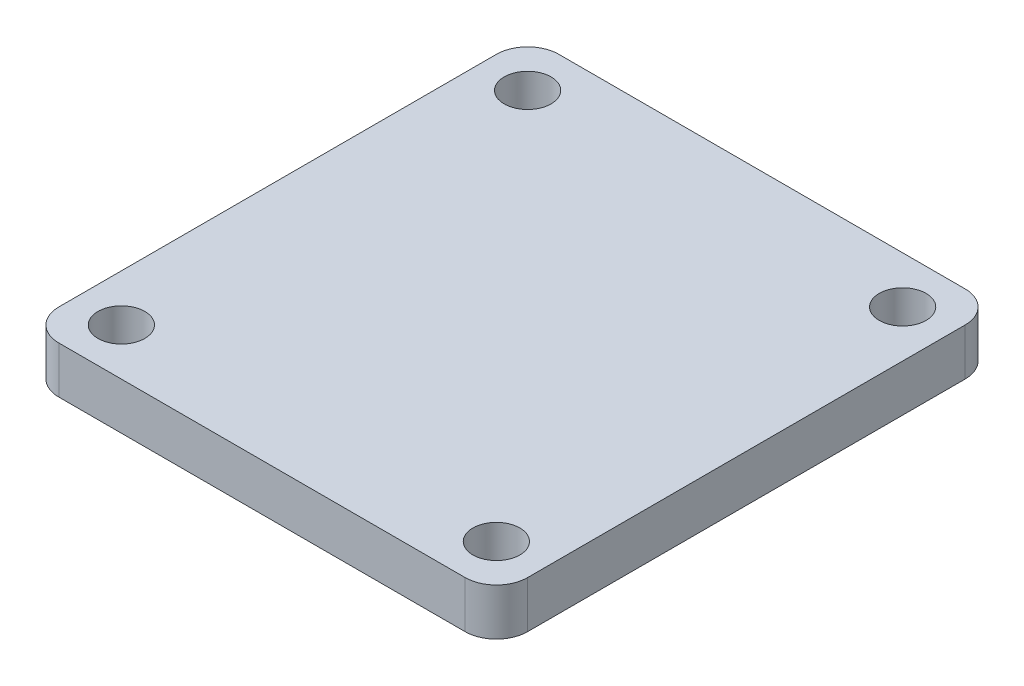
ISO-10303-21;
HEADER;
FILE_DESCRIPTION(('STEP AP214'),'2;1');
FILE_NAME('part.step','',(''),(''),'','','');
FILE_SCHEMA(('AUTOMOTIVE_DESIGN { 1 0 10303 214 1 1 1 1 }'));
ENDSEC;
DATA;
#1=APPLICATION_CONTEXT('core data for automotive mechanical design processes');
#2=APPLICATION_PROTOCOL_DEFINITION('international standard','automotive_design',2000,#1);
#3=PRODUCT_CONTEXT('',#1,'mechanical');
#4=PRODUCT('Part','Part','',(#3));
#5=PRODUCT_RELATED_PRODUCT_CATEGORY('part','',(#4));
#6=PRODUCT_DEFINITION_FORMATION('','',#4);
#7=PRODUCT_DEFINITION_CONTEXT('part definition',#1,'design');
#8=PRODUCT_DEFINITION('design','',#6,#7);
#9=PRODUCT_DEFINITION_SHAPE('','',#8);
#10=(LENGTH_UNIT() NAMED_UNIT(*) SI_UNIT(.MILLI.,.METRE.));
#11=(NAMED_UNIT(*) PLANE_ANGLE_UNIT() SI_UNIT($,.RADIAN.));
#12=(NAMED_UNIT(*) SI_UNIT($,.STERADIAN.) SOLID_ANGLE_UNIT());
#13=UNCERTAINTY_MEASURE_WITH_UNIT(LENGTH_MEASURE(1.E-05),#10,'distance_accuracy_value','');
#14=(GEOMETRIC_REPRESENTATION_CONTEXT(3) GLOBAL_UNCERTAINTY_ASSIGNED_CONTEXT((#13)) GLOBAL_UNIT_ASSIGNED_CONTEXT((#10,
#11,#12)) REPRESENTATION_CONTEXT('',''));
#15=CARTESIAN_POINT('',(0.,0.,0.));
#16=DIRECTION('',(0.,0.,1.));
#17=DIRECTION('',(1.,0.,0.));
#18=AXIS2_PLACEMENT_3D('',#15,#16,#17);
#19=CARTESIAN_POINT('',(0.,3.,0.));
#20=DIRECTION('',(0.,-1.,0.));
#21=DIRECTION('',(0.,0.,-1.));
#22=AXIS2_PLACEMENT_3D('',#19,#20,#21);
#23=PLANE('',#22);
#24=DIRECTION('',(-1.,0.,0.));
#25=VECTOR('',#24,1.);
#26=CARTESIAN_POINT('',(-15.,3.,-16.));
#27=LINE('',#26,#25);
#28=CARTESIAN_POINT('',(13.,3.,-16.));
#29=VERTEX_POINT('',#28);
#30=CARTESIAN_POINT('',(-13.,3.,-16.));
#31=VERTEX_POINT('',#30);
#32=EDGE_CURVE('E178',#29,#31,#27,.T.);
#33=ORIENTED_EDGE('',*,*,#32,.T.);
#34=CARTESIAN_POINT('',(-13.,3.,-14.));
#35=DIRECTION('',(0.,-1.,0.));
#36=DIRECTION('',(0.,0.,-1.));
#37=AXIS2_PLACEMENT_3D('',#34,#35,#36);
#38=CIRCLE('',#37,2.);
#39=CARTESIAN_POINT('',(-15.,3.,-14.));
#40=VERTEX_POINT('',#39);
#41=EDGE_CURVE('E155',#31,#40,#38,.F.);
#42=ORIENTED_EDGE('',*,*,#41,.T.);
#43=DIRECTION('',(0.,0.,1.));
#44=VECTOR('',#43,1.);
#45=CARTESIAN_POINT('',(-15.,3.,16.));
#46=LINE('',#45,#44);
#47=CARTESIAN_POINT('',(-15.,3.,14.));
#48=VERTEX_POINT('',#47);
#49=EDGE_CURVE('E125',#40,#48,#46,.T.);
#50=ORIENTED_EDGE('',*,*,#49,.T.);
#51=CARTESIAN_POINT('',(-13.,3.,14.));
#52=DIRECTION('',(0.,-1.,0.));
#53=DIRECTION('',(0.,0.,-1.));
#54=AXIS2_PLACEMENT_3D('',#51,#52,#53);
#55=CIRCLE('',#54,2.);
#56=CARTESIAN_POINT('',(-13.,3.,16.));
#57=VERTEX_POINT('',#56);
#58=EDGE_CURVE('E62',#48,#57,#55,.F.);
#59=ORIENTED_EDGE('',*,*,#58,.T.);
#60=DIRECTION('',(1.,0.,0.));
#61=VECTOR('',#60,1.);
#62=CARTESIAN_POINT('',(-15.,3.,16.));
#63=LINE('',#62,#61);
#64=CARTESIAN_POINT('',(13.,3.,16.));
#65=VERTEX_POINT('',#64);
#66=EDGE_CURVE('E141',#57,#65,#63,.T.);
#67=ORIENTED_EDGE('',*,*,#66,.T.);
#68=CARTESIAN_POINT('',(13.,3.,14.));
#69=DIRECTION('',(0.,-1.,0.));
#70=DIRECTION('',(0.,0.,-1.));
#71=AXIS2_PLACEMENT_3D('',#68,#69,#70);
#72=CIRCLE('',#71,2.);
#73=CARTESIAN_POINT('',(15.,3.,14.));
#74=VERTEX_POINT('',#73);
#75=EDGE_CURVE('E150',#65,#74,#72,.F.);
#76=ORIENTED_EDGE('',*,*,#75,.T.);
#77=DIRECTION('',(0.,0.,-1.));
#78=VECTOR('',#77,1.);
#79=CARTESIAN_POINT('',(15.,3.,16.));
#80=LINE('',#79,#78);
#81=CARTESIAN_POINT('',(15.,3.,-14.));
#82=VERTEX_POINT('',#81);
#83=EDGE_CURVE('E135',#74,#82,#80,.T.);
#84=ORIENTED_EDGE('',*,*,#83,.T.);
#85=CARTESIAN_POINT('',(13.,3.,-14.));
#86=DIRECTION('',(0.,-1.,0.));
#87=DIRECTION('',(0.,0.,-1.));
#88=AXIS2_PLACEMENT_3D('',#85,#86,#87);
#89=CIRCLE('',#88,2.);
#90=EDGE_CURVE('E152',#82,#29,#89,.F.);
#91=ORIENTED_EDGE('',*,*,#90,.T.);
#92=EDGE_LOOP('',(#33,#42,#50,#59,#67,#76,#84,#91));
#93=FACE_BOUND('',#92,.T.);
#94=CARTESIAN_POINT('',(12.,3.,-13.));
#95=DIRECTION('',(0.,1.,0.));
#96=DIRECTION('',(0.,0.,1.));
#97=AXIS2_PLACEMENT_3D('',#94,#95,#96);
#98=CIRCLE('',#97,1.5);
#99=CARTESIAN_POINT('',(12.,3.,-11.5));
#100=VERTEX_POINT('',#99);
#101=EDGE_CURVE('E171',#100,#100,#98,.T.);
#102=ORIENTED_EDGE('',*,*,#101,.F.);
#103=EDGE_LOOP('',(#102));
#104=FACE_BOUND('',#103,.T.);
#105=CARTESIAN_POINT('',(-12.,3.,-13.));
#106=DIRECTION('',(0.,1.,0.));
#107=DIRECTION('',(0.,0.,-1.));
#108=AXIS2_PLACEMENT_3D('',#105,#106,#107);
#109=CIRCLE('',#108,1.5);
#110=CARTESIAN_POINT('',(-12.,3.,-14.5));
#111=VERTEX_POINT('',#110);
#112=EDGE_CURVE('E183',#111,#111,#109,.T.);
#113=ORIENTED_EDGE('',*,*,#112,.F.);
#114=EDGE_LOOP('',(#113));
#115=FACE_BOUND('',#114,.T.);
#116=CARTESIAN_POINT('',(12.,3.,13.));
#117=DIRECTION('',(0.,1.,0.));
#118=DIRECTION('',(0.,0.,-1.));
#119=AXIS2_PLACEMENT_3D('',#116,#117,#118);
#120=CIRCLE('',#119,1.5);
#121=CARTESIAN_POINT('',(12.,3.,11.5));
#122=VERTEX_POINT('',#121);
#123=EDGE_CURVE('E188',#122,#122,#120,.T.);
#124=ORIENTED_EDGE('',*,*,#123,.F.);
#125=EDGE_LOOP('',(#124));
#126=FACE_BOUND('',#125,.T.);
#127=CARTESIAN_POINT('',(-12.,3.,13.));
#128=DIRECTION('',(0.,1.,0.));
#129=DIRECTION('',(0.,0.,1.));
#130=AXIS2_PLACEMENT_3D('',#127,#128,#129);
#131=CIRCLE('',#130,1.5);
#132=CARTESIAN_POINT('',(-12.,3.,14.5));
#133=VERTEX_POINT('',#132);
#134=EDGE_CURVE('E194',#133,#133,#131,.T.);
#135=ORIENTED_EDGE('',*,*,#134,.F.);
#136=EDGE_LOOP('',(#135));
#137=FACE_BOUND('',#136,.T.);
#138=ADVANCED_FACE('F40',(#93,#104,#115,#126,#137),#23,.F.);
#139=CARTESIAN_POINT('',(0.,0.,0.));
#140=DIRECTION('',(0.,-1.,0.));
#141=DIRECTION('',(0.,0.,-1.));
#142=AXIS2_PLACEMENT_3D('',#139,#140,#141);
#143=PLANE('',#142);
#144=CARTESIAN_POINT('',(12.,0.,13.));
#145=DIRECTION('',(0.,1.,0.));
#146=DIRECTION('',(0.,0.,-1.));
#147=AXIS2_PLACEMENT_3D('',#144,#145,#146);
#148=CIRCLE('',#147,1.5);
#149=CARTESIAN_POINT('',(12.,0.,11.5));
#150=VERTEX_POINT('',#149);
#151=EDGE_CURVE('E191',#150,#150,#148,.T.);
#152=ORIENTED_EDGE('',*,*,#151,.T.);
#153=EDGE_LOOP('',(#152));
#154=FACE_BOUND('',#153,.T.);
#155=CARTESIAN_POINT('',(12.,0.,-13.));
#156=DIRECTION('',(0.,1.,0.));
#157=DIRECTION('',(0.,0.,1.));
#158=AXIS2_PLACEMENT_3D('',#155,#156,#157);
#159=CIRCLE('',#158,1.5);
#160=CARTESIAN_POINT('',(12.,0.,-11.5));
#161=VERTEX_POINT('',#160);
#162=EDGE_CURVE('E173',#161,#161,#159,.T.);
#163=ORIENTED_EDGE('',*,*,#162,.T.);
#164=EDGE_LOOP('',(#163));
#165=FACE_BOUND('',#164,.T.);
#166=DIRECTION('',(0.,0.,1.));
#167=VECTOR('',#166,1.);
#168=CARTESIAN_POINT('',(-15.,0.,16.));
#169=LINE('',#168,#167);
#170=CARTESIAN_POINT('',(-15.,0.,-14.));
#171=VERTEX_POINT('',#170);
#172=CARTESIAN_POINT('',(-15.,0.,14.));
#173=VERTEX_POINT('',#172);
#174=EDGE_CURVE('E123',#171,#173,#169,.T.);
#175=ORIENTED_EDGE('',*,*,#174,.F.);
#176=CARTESIAN_POINT('',(-13.,0.,-14.));
#177=DIRECTION('',(0.,-1.,0.));
#178=DIRECTION('',(0.,0.,-1.));
#179=AXIS2_PLACEMENT_3D('',#176,#177,#178);
#180=CIRCLE('',#179,2.);
#181=CARTESIAN_POINT('',(-13.,0.,-16.));
#182=VERTEX_POINT('',#181);
#183=EDGE_CURVE('E106',#171,#182,#180,.T.);
#184=ORIENTED_EDGE('',*,*,#183,.T.);
#185=DIRECTION('',(-1.,0.,0.));
#186=VECTOR('',#185,1.);
#187=CARTESIAN_POINT('',(-15.,0.,-16.));
#188=LINE('',#187,#186);
#189=CARTESIAN_POINT('',(13.,0.,-16.));
#190=VERTEX_POINT('',#189);
#191=EDGE_CURVE('E133',#190,#182,#188,.T.);
#192=ORIENTED_EDGE('',*,*,#191,.F.);
#193=CARTESIAN_POINT('',(13.,0.,-14.));
#194=DIRECTION('',(0.,-1.,0.));
#195=DIRECTION('',(0.,0.,-1.));
#196=AXIS2_PLACEMENT_3D('',#193,#194,#195);
#197=CIRCLE('',#196,2.);
#198=CARTESIAN_POINT('',(15.,0.,-14.));
#199=VERTEX_POINT('',#198);
#200=EDGE_CURVE('E144',#190,#199,#197,.T.);
#201=ORIENTED_EDGE('',*,*,#200,.T.);
#202=DIRECTION('',(0.,0.,-1.));
#203=VECTOR('',#202,1.);
#204=CARTESIAN_POINT('',(15.,0.,16.));
#205=LINE('',#204,#203);
#206=CARTESIAN_POINT('',(15.,0.,14.));
#207=VERTEX_POINT('',#206);
#208=EDGE_CURVE('E137',#207,#199,#205,.T.);
#209=ORIENTED_EDGE('',*,*,#208,.F.);
#210=CARTESIAN_POINT('',(13.,0.,14.));
#211=DIRECTION('',(0.,-1.,0.));
#212=DIRECTION('',(0.,0.,-1.));
#213=AXIS2_PLACEMENT_3D('',#210,#211,#212);
#214=CIRCLE('',#213,2.);
#215=CARTESIAN_POINT('',(13.,0.,16.));
#216=VERTEX_POINT('',#215);
#217=EDGE_CURVE('E126',#207,#216,#214,.T.);
#218=ORIENTED_EDGE('',*,*,#217,.T.);
#219=DIRECTION('',(1.,0.,0.));
#220=VECTOR('',#219,1.);
#221=CARTESIAN_POINT('',(-15.,0.,16.));
#222=LINE('',#221,#220);
#223=CARTESIAN_POINT('',(-13.,0.,16.));
#224=VERTEX_POINT('',#223);
#225=EDGE_CURVE('E132',#224,#216,#222,.T.);
#226=ORIENTED_EDGE('',*,*,#225,.F.);
#227=CARTESIAN_POINT('',(-13.,0.,14.));
#228=DIRECTION('',(0.,-1.,0.));
#229=DIRECTION('',(0.,0.,-1.));
#230=AXIS2_PLACEMENT_3D('',#227,#228,#229);
#231=CIRCLE('',#230,2.);
#232=EDGE_CURVE('E117',#224,#173,#231,.T.);
#233=ORIENTED_EDGE('',*,*,#232,.T.);
#234=EDGE_LOOP('',(#175,#184,#192,#201,#209,#218,#226,#233));
#235=FACE_BOUND('',#234,.T.);
#236=CARTESIAN_POINT('',(-12.,0.,-13.));
#237=DIRECTION('',(0.,1.,0.));
#238=DIRECTION('',(0.,0.,-1.));
#239=AXIS2_PLACEMENT_3D('',#236,#237,#238);
#240=CIRCLE('',#239,1.5);
#241=CARTESIAN_POINT('',(-12.,0.,-14.5));
#242=VERTEX_POINT('',#241);
#243=EDGE_CURVE('E185',#242,#242,#240,.T.);
#244=ORIENTED_EDGE('',*,*,#243,.T.);
#245=EDGE_LOOP('',(#244));
#246=FACE_BOUND('',#245,.T.);
#247=CARTESIAN_POINT('',(-12.,0.,13.));
#248=DIRECTION('',(0.,1.,0.));
#249=DIRECTION('',(0.,0.,1.));
#250=AXIS2_PLACEMENT_3D('',#247,#248,#249);
#251=CIRCLE('',#250,1.5);
#252=CARTESIAN_POINT('',(-12.,0.,14.5));
#253=VERTEX_POINT('',#252);
#254=EDGE_CURVE('E197',#253,#253,#251,.T.);
#255=ORIENTED_EDGE('',*,*,#254,.T.);
#256=EDGE_LOOP('',(#255));
#257=FACE_BOUND('',#256,.T.);
#258=ADVANCED_FACE('F129',(#154,#165,#235,#246,#257),#143,.T.);
#259=CARTESIAN_POINT('',(15.,3.,16.));
#260=DIRECTION('',(-1.,0.,0.));
#261=DIRECTION('',(0.,0.,1.));
#262=AXIS2_PLACEMENT_3D('',#259,#260,#261);
#263=PLANE('',#262);
#264=ORIENTED_EDGE('',*,*,#208,.T.);
#265=DIRECTION('',(0.,-1.,0.));
#266=VECTOR('',#265,1.);
#267=CARTESIAN_POINT('',(15.,3.,-14.));
#268=LINE('',#267,#266);
#269=EDGE_CURVE('E11',#199,#82,#268,.F.);
#270=ORIENTED_EDGE('',*,*,#269,.T.);
#271=ORIENTED_EDGE('',*,*,#83,.F.);
#272=DIRECTION('',(0.,-1.,0.));
#273=VECTOR('',#272,1.);
#274=CARTESIAN_POINT('',(15.,3.,14.));
#275=LINE('',#274,#273);
#276=EDGE_CURVE('E48',#74,#207,#275,.T.);
#277=ORIENTED_EDGE('',*,*,#276,.T.);
#278=EDGE_LOOP('',(#264,#270,#271,#277));
#279=FACE_BOUND('',#278,.T.);
#280=ADVANCED_FACE('F166',(#279),#263,.F.);
#281=CARTESIAN_POINT('',(-15.,3.,-16.));
#282=DIRECTION('',(0.,0.,1.));
#283=DIRECTION('',(1.,0.,0.));
#284=AXIS2_PLACEMENT_3D('',#281,#282,#283);
#285=PLANE('',#284);
#286=ORIENTED_EDGE('',*,*,#191,.T.);
#287=DIRECTION('',(0.,-1.,0.));
#288=VECTOR('',#287,1.);
#289=CARTESIAN_POINT('',(-13.,3.,-16.));
#290=LINE('',#289,#288);
#291=EDGE_CURVE('E111',#182,#31,#290,.F.);
#292=ORIENTED_EDGE('',*,*,#291,.T.);
#293=ORIENTED_EDGE('',*,*,#32,.F.);
#294=DIRECTION('',(0.,-1.,0.));
#295=VECTOR('',#294,1.);
#296=CARTESIAN_POINT('',(13.,3.,-16.));
#297=LINE('',#296,#295);
#298=EDGE_CURVE('E116',#29,#190,#297,.T.);
#299=ORIENTED_EDGE('',*,*,#298,.T.);
#300=EDGE_LOOP('',(#286,#292,#293,#299));
#301=FACE_BOUND('',#300,.T.);
#302=ADVANCED_FACE('F223',(#301),#285,.F.);
#303=CARTESIAN_POINT('',(-15.,3.,16.));
#304=DIRECTION('',(1.,0.,0.));
#305=DIRECTION('',(0.,0.,-1.));
#306=AXIS2_PLACEMENT_3D('',#303,#304,#305);
#307=PLANE('',#306);
#308=ORIENTED_EDGE('',*,*,#49,.F.);
#309=DIRECTION('',(0.,-1.,0.));
#310=VECTOR('',#309,1.);
#311=CARTESIAN_POINT('',(-15.,3.,-14.));
#312=LINE('',#311,#310);
#313=EDGE_CURVE('E110',#40,#171,#312,.T.);
#314=ORIENTED_EDGE('',*,*,#313,.T.);
#315=ORIENTED_EDGE('',*,*,#174,.T.);
#316=DIRECTION('',(0.,-1.,0.));
#317=VECTOR('',#316,1.);
#318=CARTESIAN_POINT('',(-15.,3.,14.));
#319=LINE('',#318,#317);
#320=EDGE_CURVE('E127',#173,#48,#319,.F.);
#321=ORIENTED_EDGE('',*,*,#320,.T.);
#322=EDGE_LOOP('',(#308,#314,#315,#321));
#323=FACE_BOUND('',#322,.T.);
#324=ADVANCED_FACE('F122',(#323),#307,.F.);
#325=CARTESIAN_POINT('',(-15.,3.,16.));
#326=DIRECTION('',(0.,0.,-1.));
#327=DIRECTION('',(-1.,0.,0.));
#328=AXIS2_PLACEMENT_3D('',#325,#326,#327);
#329=PLANE('',#328);
#330=ORIENTED_EDGE('',*,*,#66,.F.);
#331=DIRECTION('',(0.,-1.,0.));
#332=VECTOR('',#331,1.);
#333=CARTESIAN_POINT('',(-13.,3.,16.));
#334=LINE('',#333,#332);
#335=EDGE_CURVE('E158',#57,#224,#334,.T.);
#336=ORIENTED_EDGE('',*,*,#335,.T.);
#337=ORIENTED_EDGE('',*,*,#225,.T.);
#338=DIRECTION('',(0.,-1.,0.));
#339=VECTOR('',#338,1.);
#340=CARTESIAN_POINT('',(13.,3.,16.));
#341=LINE('',#340,#339);
#342=EDGE_CURVE('E55',#216,#65,#341,.F.);
#343=ORIENTED_EDGE('',*,*,#342,.T.);
#344=EDGE_LOOP('',(#330,#336,#337,#343));
#345=FACE_BOUND('',#344,.T.);
#346=ADVANCED_FACE('F218',(#345),#329,.F.);
#347=CARTESIAN_POINT('',(12.,3.,-13.));
#348=DIRECTION('',(0.,-1.,0.));
#349=DIRECTION('',(0.,0.,-1.));
#350=AXIS2_PLACEMENT_3D('',#347,#348,#349);
#351=CYLINDRICAL_SURFACE('',#350,1.5);
#352=ORIENTED_EDGE('',*,*,#101,.T.);
#353=EDGE_LOOP('',(#352));
#354=FACE_BOUND('',#353,.T.);
#355=ORIENTED_EDGE('',*,*,#162,.F.);
#356=EDGE_LOOP('',(#355));
#357=FACE_BOUND('',#356,.T.);
#358=ADVANCED_FACE('F215',(#354,#357),#351,.F.);
#359=CARTESIAN_POINT('',(-12.,3.,-13.));
#360=DIRECTION('',(0.,-1.,0.));
#361=DIRECTION('',(0.,0.,-1.));
#362=AXIS2_PLACEMENT_3D('',#359,#360,#361);
#363=CYLINDRICAL_SURFACE('',#362,1.5);
#364=ORIENTED_EDGE('',*,*,#112,.T.);
#365=EDGE_LOOP('',(#364));
#366=FACE_BOUND('',#365,.T.);
#367=ORIENTED_EDGE('',*,*,#243,.F.);
#368=EDGE_LOOP('',(#367));
#369=FACE_BOUND('',#368,.T.);
#370=ADVANCED_FACE('F327',(#366,#369),#363,.F.);
#371=CARTESIAN_POINT('',(12.,3.,13.));
#372=DIRECTION('',(0.,-1.,0.));
#373=DIRECTION('',(0.,0.,-1.));
#374=AXIS2_PLACEMENT_3D('',#371,#372,#373);
#375=CYLINDRICAL_SURFACE('',#374,1.5);
#376=ORIENTED_EDGE('',*,*,#123,.T.);
#377=EDGE_LOOP('',(#376));
#378=FACE_BOUND('',#377,.T.);
#379=ORIENTED_EDGE('',*,*,#151,.F.);
#380=EDGE_LOOP('',(#379));
#381=FACE_BOUND('',#380,.T.);
#382=ADVANCED_FACE('F317',(#378,#381),#375,.F.);
#383=CARTESIAN_POINT('',(-12.,3.,13.));
#384=DIRECTION('',(0.,-1.,0.));
#385=DIRECTION('',(0.,0.,-1.));
#386=AXIS2_PLACEMENT_3D('',#383,#384,#385);
#387=CYLINDRICAL_SURFACE('',#386,1.5);
#388=ORIENTED_EDGE('',*,*,#134,.T.);
#389=EDGE_LOOP('',(#388));
#390=FACE_BOUND('',#389,.T.);
#391=ORIENTED_EDGE('',*,*,#254,.F.);
#392=EDGE_LOOP('',(#391));
#393=FACE_BOUND('',#392,.T.);
#394=ADVANCED_FACE('F203',(#390,#393),#387,.F.);
#395=CARTESIAN_POINT('',(-13.,3.,-14.));
#396=DIRECTION('',(0.,-1.,0.));
#397=DIRECTION('',(0.,0.,-1.));
#398=AXIS2_PLACEMENT_3D('',#395,#396,#397);
#399=CYLINDRICAL_SURFACE('',#398,2.);
#400=ORIENTED_EDGE('',*,*,#41,.F.);
#401=ORIENTED_EDGE('',*,*,#291,.F.);
#402=ORIENTED_EDGE('',*,*,#183,.F.);
#403=ORIENTED_EDGE('',*,*,#313,.F.);
#404=EDGE_LOOP('',(#400,#401,#402,#403));
#405=FACE_BOUND('',#404,.T.);
#406=ADVANCED_FACE('F109',(#405),#399,.T.);
#407=CARTESIAN_POINT('',(-13.,3.,14.));
#408=DIRECTION('',(0.,-1.,0.));
#409=DIRECTION('',(0.,0.,-1.));
#410=AXIS2_PLACEMENT_3D('',#407,#408,#409);
#411=CYLINDRICAL_SURFACE('',#410,2.);
#412=ORIENTED_EDGE('',*,*,#58,.F.);
#413=ORIENTED_EDGE('',*,*,#320,.F.);
#414=ORIENTED_EDGE('',*,*,#232,.F.);
#415=ORIENTED_EDGE('',*,*,#335,.F.);
#416=EDGE_LOOP('',(#412,#413,#414,#415));
#417=FACE_BOUND('',#416,.T.);
#418=ADVANCED_FACE('F231',(#417),#411,.T.);
#419=CARTESIAN_POINT('',(13.,3.,-14.));
#420=DIRECTION('',(0.,-1.,0.));
#421=DIRECTION('',(0.,0.,-1.));
#422=AXIS2_PLACEMENT_3D('',#419,#420,#421);
#423=CYLINDRICAL_SURFACE('',#422,2.);
#424=ORIENTED_EDGE('',*,*,#90,.F.);
#425=ORIENTED_EDGE('',*,*,#269,.F.);
#426=ORIENTED_EDGE('',*,*,#200,.F.);
#427=ORIENTED_EDGE('',*,*,#298,.F.);
#428=EDGE_LOOP('',(#424,#425,#426,#427));
#429=FACE_BOUND('',#428,.T.);
#430=ADVANCED_FACE('F233',(#429),#423,.T.);
#431=CARTESIAN_POINT('',(13.,3.,14.));
#432=DIRECTION('',(0.,-1.,0.));
#433=DIRECTION('',(0.,0.,-1.));
#434=AXIS2_PLACEMENT_3D('',#431,#432,#433);
#435=CYLINDRICAL_SURFACE('',#434,2.);
#436=ORIENTED_EDGE('',*,*,#75,.F.);
#437=ORIENTED_EDGE('',*,*,#342,.F.);
#438=ORIENTED_EDGE('',*,*,#217,.F.);
#439=ORIENTED_EDGE('',*,*,#276,.F.);
#440=EDGE_LOOP('',(#436,#437,#438,#439));
#441=FACE_BOUND('',#440,.T.);
#442=ADVANCED_FACE('F42',(#441),#435,.T.);
#443=CLOSED_SHELL('',(#138,#258,#280,#302,#324,#346,#358,#370,#382,#394,#406,#418,#430,#442));
#444=MANIFOLD_SOLID_BREP('B2',#443);
#445=ADVANCED_BREP_SHAPE_REPRESENTATION('',(#18,#444),#14);
#446=SHAPE_DEFINITION_REPRESENTATION(#9,#445);
ENDSEC;
END-ISO-10303-21;
